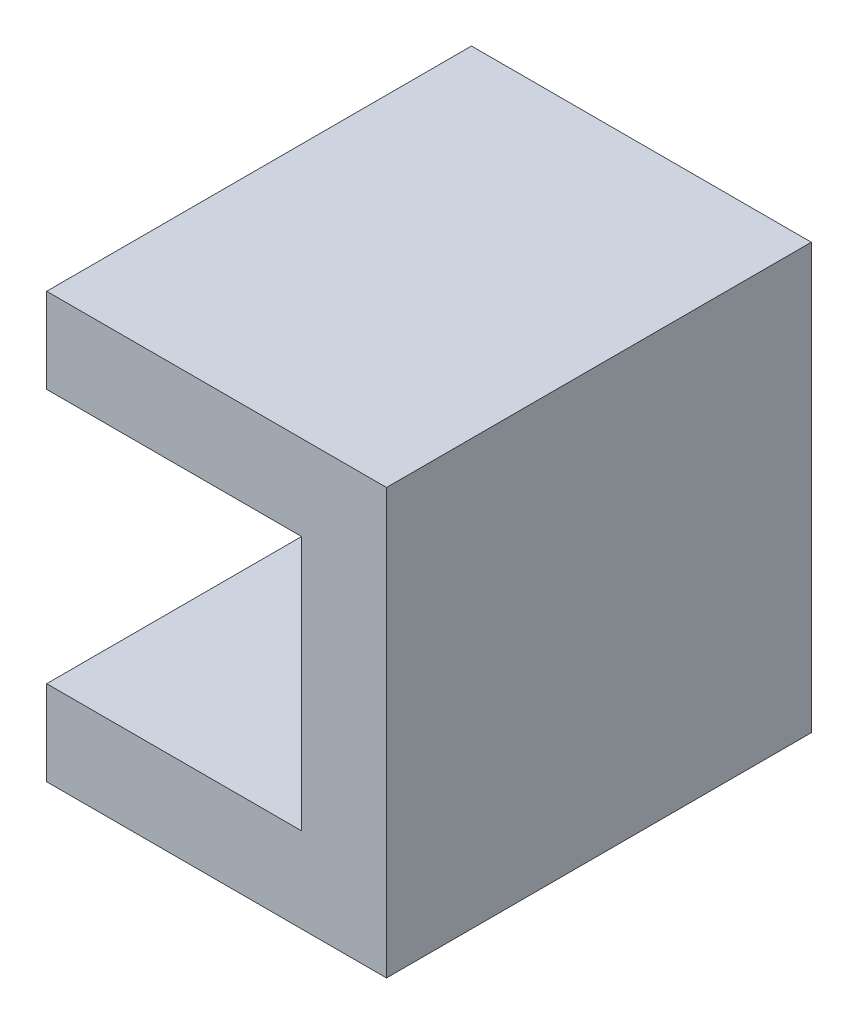
ISO-10303-21;
HEADER;
FILE_DESCRIPTION(('STEP AP214'),'2;1');
FILE_NAME('part.step','',(''),(''),'','','');
FILE_SCHEMA(('AUTOMOTIVE_DESIGN { 1 0 10303 214 1 1 1 1 }'));
ENDSEC;
DATA;
#1=APPLICATION_CONTEXT('core data for automotive mechanical design processes');
#2=APPLICATION_PROTOCOL_DEFINITION('international standard','automotive_design',2000,#1);
#3=PRODUCT_CONTEXT('',#1,'mechanical');
#4=PRODUCT('Part','Part','',(#3));
#5=PRODUCT_RELATED_PRODUCT_CATEGORY('part','',(#4));
#6=PRODUCT_DEFINITION_FORMATION('','',#4);
#7=PRODUCT_DEFINITION_CONTEXT('part definition',#1,'design');
#8=PRODUCT_DEFINITION('design','',#6,#7);
#9=PRODUCT_DEFINITION_SHAPE('','',#8);
#10=(LENGTH_UNIT() NAMED_UNIT(*) SI_UNIT(.MILLI.,.METRE.));
#11=(NAMED_UNIT(*) PLANE_ANGLE_UNIT() SI_UNIT($,.RADIAN.));
#12=(NAMED_UNIT(*) SI_UNIT($,.STERADIAN.) SOLID_ANGLE_UNIT());
#13=UNCERTAINTY_MEASURE_WITH_UNIT(LENGTH_MEASURE(1.E-05),#10,'distance_accuracy_value','');
#14=(GEOMETRIC_REPRESENTATION_CONTEXT(3) GLOBAL_UNCERTAINTY_ASSIGNED_CONTEXT((#13)) GLOBAL_UNIT_ASSIGNED_CONTEXT((#10,
#11,#12)) REPRESENTATION_CONTEXT('',''));
#15=CARTESIAN_POINT('',(0.,0.,0.));
#16=DIRECTION('',(0.,0.,1.));
#17=DIRECTION('',(1.,0.,0.));
#18=AXIS2_PLACEMENT_3D('',#15,#16,#17);
#19=CARTESIAN_POINT('',(-205.892458781285,86.7518961194133,0.));
#20=DIRECTION('',(0.,0.,1.));
#21=DIRECTION('',(1.,0.,0.));
#22=AXIS2_PLACEMENT_3D('',#19,#20,#21);
#23=PLANE('',#22);
#24=DIRECTION('',(0.,-1.,0.));
#25=VECTOR('',#24,1.);
#26=CARTESIAN_POINT('',(-225.892458781285,71.7518961194132,0.));
#27=LINE('',#26,#25);
#28=CARTESIAN_POINT('',(-225.892458781285,71.7518961194132,0.));
#29=VERTEX_POINT('',#28);
#30=CARTESIAN_POINT('',(-225.892458781285,61.7518961194132,0.));
#31=VERTEX_POINT('',#30);
#32=EDGE_CURVE('E27',#29,#31,#27,.T.);
#33=ORIENTED_EDGE('',*,*,#32,.F.);
#34=DIRECTION('',(-1.,0.,0.));
#35=VECTOR('',#34,1.);
#36=CARTESIAN_POINT('',(-195.892458781285,71.7518961194132,0.));
#37=LINE('',#36,#35);
#38=CARTESIAN_POINT('',(-195.892458781285,71.7518961194132,0.));
#39=VERTEX_POINT('',#38);
#40=EDGE_CURVE('E92',#39,#29,#37,.T.);
#41=ORIENTED_EDGE('',*,*,#40,.F.);
#42=DIRECTION('',(0.,-1.,0.));
#43=VECTOR('',#42,1.);
#44=CARTESIAN_POINT('',(-195.892458781285,101.751896119413,0.));
#45=LINE('',#44,#43);
#46=CARTESIAN_POINT('',(-195.892458781285,101.751896119413,0.));
#47=VERTEX_POINT('',#46);
#48=EDGE_CURVE('E84',#47,#39,#45,.T.);
#49=ORIENTED_EDGE('',*,*,#48,.F.);
#50=DIRECTION('',(1.,0.,0.));
#51=VECTOR('',#50,1.);
#52=CARTESIAN_POINT('',(-225.892458781285,101.751896119413,0.));
#53=LINE('',#52,#51);
#54=CARTESIAN_POINT('',(-225.892458781285,101.751896119413,0.));
#55=VERTEX_POINT('',#54);
#56=EDGE_CURVE('E140',#55,#47,#53,.T.);
#57=ORIENTED_EDGE('',*,*,#56,.F.);
#58=DIRECTION('',(0.,-1.,0.));
#59=VECTOR('',#58,1.);
#60=CARTESIAN_POINT('',(-225.892458781285,111.751896119413,0.));
#61=LINE('',#60,#59);
#62=CARTESIAN_POINT('',(-225.892458781285,111.751896119413,0.));
#63=VERTEX_POINT('',#62);
#64=EDGE_CURVE('E130',#63,#55,#61,.T.);
#65=ORIENTED_EDGE('',*,*,#64,.F.);
#66=DIRECTION('',(-1.,0.,0.));
#67=VECTOR('',#66,1.);
#68=CARTESIAN_POINT('',(-185.892458781285,111.751896119413,0.));
#69=LINE('',#68,#67);
#70=CARTESIAN_POINT('',(-185.892458781285,111.751896119413,0.));
#71=VERTEX_POINT('',#70);
#72=EDGE_CURVE('E117',#71,#63,#69,.T.);
#73=ORIENTED_EDGE('',*,*,#72,.F.);
#74=DIRECTION('',(0.,1.,0.));
#75=VECTOR('',#74,1.);
#76=CARTESIAN_POINT('',(-185.892458781285,61.7518961194132,0.));
#77=LINE('',#76,#75);
#78=CARTESIAN_POINT('',(-185.892458781285,61.7518961194132,0.));
#79=VERTEX_POINT('',#78);
#80=EDGE_CURVE('E62',#79,#71,#77,.T.);
#81=ORIENTED_EDGE('',*,*,#80,.F.);
#82=DIRECTION('',(1.,0.,0.));
#83=VECTOR('',#82,1.);
#84=CARTESIAN_POINT('',(-225.892458781285,61.7518961194132,0.));
#85=LINE('',#84,#83);
#86=EDGE_CURVE('E93',#31,#79,#85,.T.);
#87=ORIENTED_EDGE('',*,*,#86,.F.);
#88=EDGE_LOOP('',(#33,#41,#49,#57,#65,#73,#81,#87));
#89=FACE_BOUND('',#88,.T.);
#90=ADVANCED_FACE('F16',(#89),#23,.F.);
#91=CARTESIAN_POINT('',(-205.892458781285,86.7518961194133,50.));
#92=DIRECTION('',(0.,0.,1.));
#93=DIRECTION('',(1.,0.,0.));
#94=AXIS2_PLACEMENT_3D('',#91,#92,#93);
#95=PLANE('',#94);
#96=DIRECTION('',(0.,-1.,0.));
#97=VECTOR('',#96,1.);
#98=CARTESIAN_POINT('',(-225.892458781285,71.7518961194132,50.));
#99=LINE('',#98,#97);
#100=CARTESIAN_POINT('',(-225.892458781285,71.7518961194132,50.));
#101=VERTEX_POINT('',#100);
#102=CARTESIAN_POINT('',(-225.892458781285,61.7518961194132,50.));
#103=VERTEX_POINT('',#102);
#104=EDGE_CURVE('E11',#101,#103,#99,.T.);
#105=ORIENTED_EDGE('',*,*,#104,.T.);
#106=DIRECTION('',(1.,0.,0.));
#107=VECTOR('',#106,1.);
#108=CARTESIAN_POINT('',(-225.892458781285,61.7518961194132,50.));
#109=LINE('',#108,#107);
#110=CARTESIAN_POINT('',(-185.892458781285,61.7518961194132,50.));
#111=VERTEX_POINT('',#110);
#112=EDGE_CURVE('E20',#103,#111,#109,.T.);
#113=ORIENTED_EDGE('',*,*,#112,.T.);
#114=DIRECTION('',(0.,1.,0.));
#115=VECTOR('',#114,1.);
#116=CARTESIAN_POINT('',(-185.892458781285,61.7518961194132,50.));
#117=LINE('',#116,#115);
#118=CARTESIAN_POINT('',(-185.892458781285,111.751896119413,50.));
#119=VERTEX_POINT('',#118);
#120=EDGE_CURVE('E53',#111,#119,#117,.T.);
#121=ORIENTED_EDGE('',*,*,#120,.T.);
#122=DIRECTION('',(-1.,0.,0.));
#123=VECTOR('',#122,1.);
#124=CARTESIAN_POINT('',(-185.892458781285,111.751896119413,50.));
#125=LINE('',#124,#123);
#126=CARTESIAN_POINT('',(-225.892458781285,111.751896119413,50.));
#127=VERTEX_POINT('',#126);
#128=EDGE_CURVE('E120',#119,#127,#125,.T.);
#129=ORIENTED_EDGE('',*,*,#128,.T.);
#130=DIRECTION('',(0.,-1.,0.));
#131=VECTOR('',#130,1.);
#132=CARTESIAN_POINT('',(-225.892458781285,111.751896119413,50.));
#133=LINE('',#132,#131);
#134=CARTESIAN_POINT('',(-225.892458781285,101.751896119413,50.));
#135=VERTEX_POINT('',#134);
#136=EDGE_CURVE('E141',#127,#135,#133,.T.);
#137=ORIENTED_EDGE('',*,*,#136,.T.);
#138=DIRECTION('',(1.,0.,0.));
#139=VECTOR('',#138,1.);
#140=CARTESIAN_POINT('',(-225.892458781285,101.751896119413,50.));
#141=LINE('',#140,#139);
#142=CARTESIAN_POINT('',(-195.892458781285,101.751896119413,50.));
#143=VERTEX_POINT('',#142);
#144=EDGE_CURVE('E131',#135,#143,#141,.T.);
#145=ORIENTED_EDGE('',*,*,#144,.T.);
#146=DIRECTION('',(0.,-1.,0.));
#147=VECTOR('',#146,1.);
#148=CARTESIAN_POINT('',(-195.892458781285,101.751896119413,50.));
#149=LINE('',#148,#147);
#150=CARTESIAN_POINT('',(-195.892458781285,71.7518961194132,50.));
#151=VERTEX_POINT('',#150);
#152=EDGE_CURVE('E122',#143,#151,#149,.T.);
#153=ORIENTED_EDGE('',*,*,#152,.T.);
#154=DIRECTION('',(-1.,0.,0.));
#155=VECTOR('',#154,1.);
#156=CARTESIAN_POINT('',(-195.892458781285,71.7518961194132,50.));
#157=LINE('',#156,#155);
#158=EDGE_CURVE('E105',#151,#101,#157,.T.);
#159=ORIENTED_EDGE('',*,*,#158,.T.);
#160=EDGE_LOOP('',(#105,#113,#121,#129,#137,#145,#153,#159));
#161=FACE_BOUND('',#160,.T.);
#162=ADVANCED_FACE('F177',(#161),#95,.T.);
#163=CARTESIAN_POINT('',(-225.892458781285,71.7518961194132,0.));
#164=DIRECTION('',(-1.,0.,0.));
#165=DIRECTION('',(0.,-1.,0.));
#166=AXIS2_PLACEMENT_3D('',#163,#164,#165);
#167=PLANE('',#166);
#168=ORIENTED_EDGE('',*,*,#32,.T.);
#169=DIRECTION('',(0.,0.,1.));
#170=VECTOR('',#169,1.);
#171=CARTESIAN_POINT('',(-225.892458781285,61.7518961194132,0.));
#172=LINE('',#171,#170);
#173=EDGE_CURVE('E97',#31,#103,#172,.T.);
#174=ORIENTED_EDGE('',*,*,#173,.T.);
#175=ORIENTED_EDGE('',*,*,#104,.F.);
#176=DIRECTION('',(0.,0.,1.));
#177=VECTOR('',#176,1.);
#178=CARTESIAN_POINT('',(-225.892458781285,71.7518961194132,0.));
#179=LINE('',#178,#177);
#180=EDGE_CURVE('E100',#29,#101,#179,.T.);
#181=ORIENTED_EDGE('',*,*,#180,.F.);
#182=EDGE_LOOP('',(#168,#174,#175,#181));
#183=FACE_BOUND('',#182,.T.);
#184=ADVANCED_FACE('F101',(#183),#167,.T.);
#185=CARTESIAN_POINT('',(-225.892458781285,61.7518961194132,0.));
#186=DIRECTION('',(0.,-1.,0.));
#187=DIRECTION('',(1.,0.,0.));
#188=AXIS2_PLACEMENT_3D('',#185,#186,#187);
#189=PLANE('',#188);
#190=ORIENTED_EDGE('',*,*,#86,.T.);
#191=DIRECTION('',(0.,0.,1.));
#192=VECTOR('',#191,1.);
#193=CARTESIAN_POINT('',(-185.892458781285,61.7518961194132,0.));
#194=LINE('',#193,#192);
#195=EDGE_CURVE('E116',#79,#111,#194,.T.);
#196=ORIENTED_EDGE('',*,*,#195,.T.);
#197=ORIENTED_EDGE('',*,*,#112,.F.);
#198=ORIENTED_EDGE('',*,*,#173,.F.);
#199=EDGE_LOOP('',(#190,#196,#197,#198));
#200=FACE_BOUND('',#199,.T.);
#201=ADVANCED_FACE('F204',(#200),#189,.T.);
#202=CARTESIAN_POINT('',(-185.892458781285,61.7518961194132,0.));
#203=DIRECTION('',(1.,0.,0.));
#204=DIRECTION('',(0.,1.,0.));
#205=AXIS2_PLACEMENT_3D('',#202,#203,#204);
#206=PLANE('',#205);
#207=ORIENTED_EDGE('',*,*,#80,.T.);
#208=DIRECTION('',(0.,0.,1.));
#209=VECTOR('',#208,1.);
#210=CARTESIAN_POINT('',(-185.892458781285,111.751896119413,0.));
#211=LINE('',#210,#209);
#212=EDGE_CURVE('E134',#71,#119,#211,.T.);
#213=ORIENTED_EDGE('',*,*,#212,.T.);
#214=ORIENTED_EDGE('',*,*,#120,.F.);
#215=ORIENTED_EDGE('',*,*,#195,.F.);
#216=EDGE_LOOP('',(#207,#213,#214,#215));
#217=FACE_BOUND('',#216,.T.);
#218=ADVANCED_FACE('F171',(#217),#206,.T.);
#219=CARTESIAN_POINT('',(-185.892458781285,111.751896119413,0.));
#220=DIRECTION('',(0.,1.,0.));
#221=DIRECTION('',(-1.,0.,0.));
#222=AXIS2_PLACEMENT_3D('',#219,#220,#221);
#223=PLANE('',#222);
#224=ORIENTED_EDGE('',*,*,#72,.T.);
#225=DIRECTION('',(0.,0.,1.));
#226=VECTOR('',#225,1.);
#227=CARTESIAN_POINT('',(-225.892458781285,111.751896119413,0.));
#228=LINE('',#227,#226);
#229=EDGE_CURVE('E121',#63,#127,#228,.T.);
#230=ORIENTED_EDGE('',*,*,#229,.T.);
#231=ORIENTED_EDGE('',*,*,#128,.F.);
#232=ORIENTED_EDGE('',*,*,#212,.F.);
#233=EDGE_LOOP('',(#224,#230,#231,#232));
#234=FACE_BOUND('',#233,.T.);
#235=ADVANCED_FACE('F174',(#234),#223,.T.);
#236=CARTESIAN_POINT('',(-225.892458781285,111.751896119413,0.));
#237=DIRECTION('',(-1.,0.,0.));
#238=DIRECTION('',(0.,-1.,0.));
#239=AXIS2_PLACEMENT_3D('',#236,#237,#238);
#240=PLANE('',#239);
#241=ORIENTED_EDGE('',*,*,#64,.T.);
#242=DIRECTION('',(0.,0.,1.));
#243=VECTOR('',#242,1.);
#244=CARTESIAN_POINT('',(-225.892458781285,101.751896119413,0.));
#245=LINE('',#244,#243);
#246=EDGE_CURVE('E126',#55,#135,#245,.T.);
#247=ORIENTED_EDGE('',*,*,#246,.T.);
#248=ORIENTED_EDGE('',*,*,#136,.F.);
#249=ORIENTED_EDGE('',*,*,#229,.F.);
#250=EDGE_LOOP('',(#241,#247,#248,#249));
#251=FACE_BOUND('',#250,.T.);
#252=ADVANCED_FACE('F181',(#251),#240,.T.);
#253=CARTESIAN_POINT('',(-225.892458781285,101.751896119413,0.));
#254=DIRECTION('',(0.,-1.,0.));
#255=DIRECTION('',(1.,0.,0.));
#256=AXIS2_PLACEMENT_3D('',#253,#254,#255);
#257=PLANE('',#256);
#258=ORIENTED_EDGE('',*,*,#56,.T.);
#259=DIRECTION('',(0.,0.,1.));
#260=VECTOR('',#259,1.);
#261=CARTESIAN_POINT('',(-195.892458781285,101.751896119413,0.));
#262=LINE('',#261,#260);
#263=EDGE_CURVE('E124',#47,#143,#262,.T.);
#264=ORIENTED_EDGE('',*,*,#263,.T.);
#265=ORIENTED_EDGE('',*,*,#144,.F.);
#266=ORIENTED_EDGE('',*,*,#246,.F.);
#267=EDGE_LOOP('',(#258,#264,#265,#266));
#268=FACE_BOUND('',#267,.T.);
#269=ADVANCED_FACE('F185',(#268),#257,.T.);
#270=CARTESIAN_POINT('',(-195.892458781285,101.751896119413,0.));
#271=DIRECTION('',(-1.,0.,0.));
#272=DIRECTION('',(0.,-1.,0.));
#273=AXIS2_PLACEMENT_3D('',#270,#271,#272);
#274=PLANE('',#273);
#275=ORIENTED_EDGE('',*,*,#48,.T.);
#276=DIRECTION('',(0.,0.,1.));
#277=VECTOR('',#276,1.);
#278=CARTESIAN_POINT('',(-195.892458781285,71.7518961194132,0.));
#279=LINE('',#278,#277);
#280=EDGE_CURVE('E108',#39,#151,#279,.T.);
#281=ORIENTED_EDGE('',*,*,#280,.T.);
#282=ORIENTED_EDGE('',*,*,#152,.F.);
#283=ORIENTED_EDGE('',*,*,#263,.F.);
#284=EDGE_LOOP('',(#275,#281,#282,#283));
#285=FACE_BOUND('',#284,.T.);
#286=ADVANCED_FACE('F18',(#285),#274,.T.);
#287=CARTESIAN_POINT('',(-195.892458781285,71.7518961194132,0.));
#288=DIRECTION('',(0.,1.,0.));
#289=DIRECTION('',(-1.,0.,0.));
#290=AXIS2_PLACEMENT_3D('',#287,#288,#289);
#291=PLANE('',#290);
#292=ORIENTED_EDGE('',*,*,#40,.T.);
#293=ORIENTED_EDGE('',*,*,#180,.T.);
#294=ORIENTED_EDGE('',*,*,#158,.F.);
#295=ORIENTED_EDGE('',*,*,#280,.F.);
#296=EDGE_LOOP('',(#292,#293,#294,#295));
#297=FACE_BOUND('',#296,.T.);
#298=ADVANCED_FACE('F107',(#297),#291,.T.);
#299=CLOSED_SHELL('',(#90,#162,#184,#201,#218,#235,#252,#269,#286,#298));
#300=MANIFOLD_SOLID_BREP('B1',#299);
#301=ADVANCED_BREP_SHAPE_REPRESENTATION('',(#18,#300),#14);
#302=SHAPE_DEFINITION_REPRESENTATION(#9,#301);
ENDSEC;
END-ISO-10303-21;
